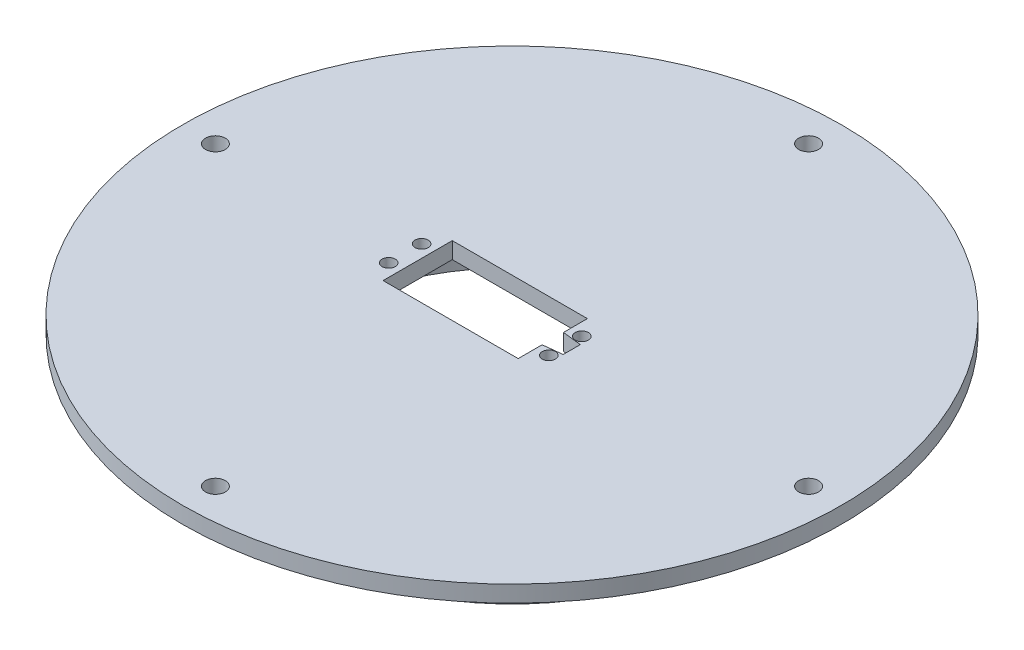
ISO-10303-21;
HEADER;
FILE_DESCRIPTION(('STEP AP214'),'2;1');
FILE_NAME('part.step','',(''),(''),'','','');
FILE_SCHEMA(('AUTOMOTIVE_DESIGN { 1 0 10303 214 1 1 1 1 }'));
ENDSEC;
DATA;
#1=APPLICATION_CONTEXT('core data for automotive mechanical design processes');
#2=APPLICATION_PROTOCOL_DEFINITION('international standard','automotive_design',2000,#1);
#3=PRODUCT_CONTEXT('',#1,'mechanical');
#4=PRODUCT('Part','Part','',(#3));
#5=PRODUCT_RELATED_PRODUCT_CATEGORY('part','',(#4));
#6=PRODUCT_DEFINITION_FORMATION('','',#4);
#7=PRODUCT_DEFINITION_CONTEXT('part definition',#1,'design');
#8=PRODUCT_DEFINITION('design','',#6,#7);
#9=PRODUCT_DEFINITION_SHAPE('','',#8);
#10=(LENGTH_UNIT() NAMED_UNIT(*) SI_UNIT(.MILLI.,.METRE.));
#11=(NAMED_UNIT(*) PLANE_ANGLE_UNIT() SI_UNIT($,.RADIAN.));
#12=(NAMED_UNIT(*) SI_UNIT($,.STERADIAN.) SOLID_ANGLE_UNIT());
#13=UNCERTAINTY_MEASURE_WITH_UNIT(LENGTH_MEASURE(1.E-05),#10,'distance_accuracy_value','');
#14=(GEOMETRIC_REPRESENTATION_CONTEXT(3) GLOBAL_UNCERTAINTY_ASSIGNED_CONTEXT((#13)) GLOBAL_UNIT_ASSIGNED_CONTEXT((#10,
#11,#12)) REPRESENTATION_CONTEXT('',''));
#15=CARTESIAN_POINT('',(0.,0.,0.));
#16=DIRECTION('',(0.,0.,1.));
#17=DIRECTION('',(1.,0.,0.));
#18=AXIS2_PLACEMENT_3D('',#15,#16,#17);
#19=CARTESIAN_POINT('',(0.,-25.,0.));
#20=DIRECTION('',(0.,-1.,0.));
#21=DIRECTION('',(0.,0.,-1.));
#22=AXIS2_PLACEMENT_3D('',#19,#20,#21);
#23=PLANE('',#22);
#24=CARTESIAN_POINT('',(0.,-25.,0.));
#25=DIRECTION('',(0.,-1.,0.));
#26=DIRECTION('',(0.,0.,-1.));
#27=AXIS2_PLACEMENT_3D('',#24,#25,#26);
#28=CIRCLE('',#27,65.);
#29=CARTESIAN_POINT('',(64.8074069840786,-25.,5.));
#30=VERTEX_POINT('',#29);
#31=CARTESIAN_POINT('',(64.8074069840786,-25.,-5.));
#32=VERTEX_POINT('',#31);
#33=EDGE_CURVE('E146',#30,#32,#28,.T.);
#34=ORIENTED_EDGE('',*,*,#33,.T.);
#35=DIRECTION('',(-1.,0.,0.));
#36=VECTOR('',#35,1.);
#37=CARTESIAN_POINT('',(100.,-25.,-5.));
#38=LINE('',#37,#36);
#39=CARTESIAN_POINT('',(59.791303715507,-25.,-5.));
#40=VERTEX_POINT('',#39);
#41=EDGE_CURVE('E129',#32,#40,#38,.T.);
#42=ORIENTED_EDGE('',*,*,#41,.T.);
#43=CARTESIAN_POINT('',(0.,-25.,0.));
#44=DIRECTION('',(0.,-1.,0.));
#45=DIRECTION('',(0.,0.,-1.));
#46=AXIS2_PLACEMENT_3D('',#43,#44,#45);
#47=CIRCLE('',#46,60.);
#48=CARTESIAN_POINT('',(59.791303715507,-25.,5.));
#49=VERTEX_POINT('',#48);
#50=EDGE_CURVE('E149',#49,#40,#47,.T.);
#51=ORIENTED_EDGE('',*,*,#50,.F.);
#52=DIRECTION('',(-1.,0.,0.));
#53=VECTOR('',#52,1.);
#54=CARTESIAN_POINT('',(100.,-25.,5.));
#55=LINE('',#54,#53);
#56=EDGE_CURVE('E57',#30,#49,#55,.T.);
#57=ORIENTED_EDGE('',*,*,#56,.F.);
#58=EDGE_LOOP('',(#34,#42,#51,#57));
#59=FACE_BOUND('',#58,.T.);
#60=ADVANCED_FACE('F41',(#59),#23,.T.);
#61=CARTESIAN_POINT('',(0.,-25.,0.));
#62=DIRECTION('',(0.,1.,0.));
#63=DIRECTION('',(0.,0.,1.));
#64=AXIS2_PLACEMENT_3D('',#61,#62,#63);
#65=CYLINDRICAL_SURFACE('',#64,65.);
#66=CARTESIAN_POINT('',(0.,0.,0.));
#67=DIRECTION('',(0.,-1.,0.));
#68=DIRECTION('',(0.,0.,-1.));
#69=AXIS2_PLACEMENT_3D('',#66,#67,#68);
#70=CIRCLE('',#69,65.);
#71=CARTESIAN_POINT('',(0.,0.,-65.));
#72=VERTEX_POINT('',#71);
#73=EDGE_CURVE('E159',#72,#72,#70,.T.);
#74=ORIENTED_EDGE('',*,*,#73,.T.);
#75=EDGE_LOOP('',(#74));
#76=FACE_BOUND('',#75,.T.);
#77=DIRECTION('',(0.,1.,0.));
#78=VECTOR('',#77,1.);
#79=CARTESIAN_POINT('',(64.8074069840786,-25.,-5.));
#80=LINE('',#79,#78);
#81=CARTESIAN_POINT('',(64.8074069840786,-19.,-5.));
#82=VERTEX_POINT('',#81);
#83=EDGE_CURVE('E135',#32,#82,#80,.T.);
#84=ORIENTED_EDGE('',*,*,#83,.F.);
#85=ORIENTED_EDGE('',*,*,#33,.F.);
#86=DIRECTION('',(0.,1.,0.));
#87=VECTOR('',#86,1.);
#88=CARTESIAN_POINT('',(64.8074069840786,-25.,5.));
#89=LINE('',#88,#87);
#90=CARTESIAN_POINT('',(64.8074069840786,-19.,5.));
#91=VERTEX_POINT('',#90);
#92=EDGE_CURVE('E262',#91,#30,#89,.F.);
#93=ORIENTED_EDGE('',*,*,#92,.F.);
#94=CARTESIAN_POINT('',(0.,-19.,0.));
#95=DIRECTION('',(0.,-1.,0.));
#96=DIRECTION('',(0.,0.,-1.));
#97=AXIS2_PLACEMENT_3D('',#94,#95,#96);
#98=CIRCLE('',#97,65.);
#99=EDGE_CURVE('E150',#82,#91,#98,.T.);
#100=ORIENTED_EDGE('',*,*,#99,.F.);
#101=EDGE_LOOP('',(#84,#85,#93,#100));
#102=FACE_BOUND('',#101,.T.);
#103=ADVANCED_FACE('F144',(#76,#102),#65,.T.);
#104=CARTESIAN_POINT('',(0.,-25.,0.));
#105=DIRECTION('',(0.,1.,0.));
#106=DIRECTION('',(0.,0.,1.));
#107=AXIS2_PLACEMENT_3D('',#104,#105,#106);
#108=CYLINDRICAL_SURFACE('',#107,60.);
#109=CARTESIAN_POINT('',(0.,0.,0.));
#110=DIRECTION('',(0.,-1.,0.));
#111=DIRECTION('',(0.,0.,-1.));
#112=AXIS2_PLACEMENT_3D('',#109,#110,#111);
#113=CIRCLE('',#112,60.);
#114=CARTESIAN_POINT('',(0.,0.,-60.));
#115=VERTEX_POINT('',#114);
#116=EDGE_CURVE('E151',#115,#115,#113,.T.);
#117=ORIENTED_EDGE('',*,*,#116,.F.);
#118=EDGE_LOOP('',(#117));
#119=FACE_BOUND('',#118,.T.);
#120=ORIENTED_EDGE('',*,*,#50,.T.);
#121=DIRECTION('',(0.,1.,0.));
#122=VECTOR('',#121,1.);
#123=CARTESIAN_POINT('',(59.791303715507,-25.,-5.));
#124=LINE('',#123,#122);
#125=CARTESIAN_POINT('',(59.791303715507,-19.,-5.));
#126=VERTEX_POINT('',#125);
#127=EDGE_CURVE('E11',#40,#126,#124,.T.);
#128=ORIENTED_EDGE('',*,*,#127,.T.);
#129=CARTESIAN_POINT('',(0.,-19.,0.));
#130=DIRECTION('',(0.,-1.,0.));
#131=DIRECTION('',(0.,0.,-1.));
#132=AXIS2_PLACEMENT_3D('',#129,#130,#131);
#133=CIRCLE('',#132,60.);
#134=CARTESIAN_POINT('',(59.791303715507,-19.,5.));
#135=VERTEX_POINT('',#134);
#136=EDGE_CURVE('E47',#126,#135,#133,.T.);
#137=ORIENTED_EDGE('',*,*,#136,.T.);
#138=DIRECTION('',(0.,1.,0.));
#139=VECTOR('',#138,1.);
#140=CARTESIAN_POINT('',(59.791303715507,-25.,5.));
#141=LINE('',#140,#139);
#142=EDGE_CURVE('E254',#135,#49,#141,.F.);
#143=ORIENTED_EDGE('',*,*,#142,.T.);
#144=EDGE_LOOP('',(#120,#128,#137,#143));
#145=FACE_BOUND('',#144,.T.);
#146=ADVANCED_FACE('F256',(#119,#145),#108,.F.);
#147=CARTESIAN_POINT('',(12.3770131335218,10.,-10.5));
#148=DIRECTION('',(-1.,0.,0.));
#149=DIRECTION('',(0.,0.,1.));
#150=AXIS2_PLACEMENT_3D('',#147,#148,#149);
#151=PLANE('',#150);
#152=DIRECTION('',(0.,0.,-1.));
#153=VECTOR('',#152,1.);
#154=CARTESIAN_POINT('',(12.3770131335218,0.,-10.5));
#155=LINE('',#154,#153);
#156=CARTESIAN_POINT('',(12.3770131335218,0.,-3.24999999999999));
#157=VERTEX_POINT('',#156);
#158=CARTESIAN_POINT('',(12.3770131335218,0.,-10.5));
#159=VERTEX_POINT('',#158);
#160=EDGE_CURVE('E185',#157,#159,#155,.T.);
#161=ORIENTED_EDGE('',*,*,#160,.F.);
#162=DIRECTION('',(0.,1.,0.));
#163=VECTOR('',#162,1.);
#164=CARTESIAN_POINT('',(12.3770131335218,-25.,-3.24999999999999));
#165=LINE('',#164,#163);
#166=CARTESIAN_POINT('',(12.3770131335218,5.,-3.24999999999999));
#167=VERTEX_POINT('',#166);
#168=EDGE_CURVE('E277',#157,#167,#165,.T.);
#169=ORIENTED_EDGE('',*,*,#168,.T.);
#170=DIRECTION('',(0.,0.,1.));
#171=VECTOR('',#170,1.);
#172=CARTESIAN_POINT('',(12.3770131335218,5.,0.));
#173=LINE('',#172,#171);
#174=CARTESIAN_POINT('',(12.3770131335218,5.,-10.5));
#175=VERTEX_POINT('',#174);
#176=EDGE_CURVE('E202',#175,#167,#173,.T.);
#177=ORIENTED_EDGE('',*,*,#176,.F.);
#178=DIRECTION('',(0.,-1.,0.));
#179=VECTOR('',#178,1.);
#180=CARTESIAN_POINT('',(12.3770131335218,10.,-10.5));
#181=LINE('',#180,#179);
#182=EDGE_CURVE('E173',#175,#159,#181,.T.);
#183=ORIENTED_EDGE('',*,*,#182,.T.);
#184=EDGE_LOOP('',(#161,#169,#177,#183));
#185=FACE_BOUND('',#184,.T.);
#186=ADVANCED_FACE('F300',(#185),#151,.T.);
#187=CARTESIAN_POINT('',(0.,0.,0.));
#188=DIRECTION('',(0.,1.,0.));
#189=DIRECTION('',(0.,0.,1.));
#190=AXIS2_PLACEMENT_3D('',#187,#188,#189);
#191=PLANE('',#190);
#192=ORIENTED_EDGE('',*,*,#116,.T.);
#193=EDGE_LOOP('',(#192));
#194=FACE_BOUND('',#193,.T.);
#195=CARTESIAN_POINT('',(-32.4229868664782,0.,-5.00000000000001));
#196=DIRECTION('',(0.,1.,0.));
#197=DIRECTION('',(0.,0.,-1.));
#198=AXIS2_PLACEMENT_3D('',#195,#196,#197);
#199=CIRCLE('',#198,2.00000000000001);
#200=CARTESIAN_POINT('',(-32.4229868664782,0.,-7.00000000000002));
#201=VERTEX_POINT('',#200);
#202=EDGE_CURVE('E148',#201,#201,#199,.T.);
#203=ORIENTED_EDGE('',*,*,#202,.T.);
#204=EDGE_LOOP('',(#203));
#205=FACE_BOUND('',#204,.T.);
#206=CARTESIAN_POINT('',(-32.4229868664782,0.,5.00000000000001));
#207=DIRECTION('',(0.,1.,0.));
#208=DIRECTION('',(0.,0.,1.));
#209=AXIS2_PLACEMENT_3D('',#206,#207,#208);
#210=CIRCLE('',#209,2.);
#211=CARTESIAN_POINT('',(-32.4229868664782,0.,7.));
#212=VERTEX_POINT('',#211);
#213=EDGE_CURVE('E152',#212,#212,#210,.T.);
#214=ORIENTED_EDGE('',*,*,#213,.T.);
#215=EDGE_LOOP('',(#214));
#216=FACE_BOUND('',#215,.T.);
#217=CARTESIAN_POINT('',(16.1770131335218,0.,5.));
#218=DIRECTION('',(0.,1.,0.));
#219=DIRECTION('',(0.,0.,-1.));
#220=AXIS2_PLACEMENT_3D('',#217,#218,#219);
#221=CIRCLE('',#220,2.);
#222=CARTESIAN_POINT('',(16.1770131335218,0.,3.));
#223=VERTEX_POINT('',#222);
#224=EDGE_CURVE('E165',#223,#223,#221,.T.);
#225=ORIENTED_EDGE('',*,*,#224,.T.);
#226=EDGE_LOOP('',(#225));
#227=FACE_BOUND('',#226,.T.);
#228=CARTESIAN_POINT('',(16.1770131335218,0.,-5.));
#229=DIRECTION('',(0.,1.,0.));
#230=DIRECTION('',(0.,0.,1.));
#231=AXIS2_PLACEMENT_3D('',#228,#229,#230);
#232=CIRCLE('',#231,2.);
#233=CARTESIAN_POINT('',(16.1770131335218,0.,-3.));
#234=VERTEX_POINT('',#233);
#235=EDGE_CURVE('E170',#234,#234,#232,.T.);
#236=ORIENTED_EDGE('',*,*,#235,.T.);
#237=EDGE_LOOP('',(#236));
#238=FACE_BOUND('',#237,.T.);
#239=DIRECTION('',(0.99367593409907,0.,0.112285965250968));
#240=VECTOR('',#239,1.);
#241=CARTESIAN_POINT('',(0.518672639093123,0.,-4.58999945354297));
#242=LINE('',#241,#240);
#243=CARTESIAN_POINT('',(18.1291955698643,0.,-2.6));
#244=VERTEX_POINT('',#243);
#245=EDGE_CURVE('E252',#157,#244,#242,.T.);
#246=ORIENTED_EDGE('',*,*,#245,.F.);
#247=ORIENTED_EDGE('',*,*,#160,.T.);
#248=DIRECTION('',(-1.,0.,0.));
#249=VECTOR('',#248,1.);
#250=CARTESIAN_POINT('',(-28.6229868664782,0.,-10.5));
#251=LINE('',#250,#249);
#252=CARTESIAN_POINT('',(-28.6229868664782,0.,-10.5));
#253=VERTEX_POINT('',#252);
#254=EDGE_CURVE('E177',#159,#253,#251,.T.);
#255=ORIENTED_EDGE('',*,*,#254,.T.);
#256=DIRECTION('',(0.,0.,1.));
#257=VECTOR('',#256,1.);
#258=CARTESIAN_POINT('',(-28.6229868664782,0.,-10.5));
#259=LINE('',#258,#257);
#260=CARTESIAN_POINT('',(-28.6229868664782,0.,10.5));
#261=VERTEX_POINT('',#260);
#262=EDGE_CURVE('E166',#253,#261,#259,.T.);
#263=ORIENTED_EDGE('',*,*,#262,.T.);
#264=DIRECTION('',(1.,0.,0.));
#265=VECTOR('',#264,1.);
#266=CARTESIAN_POINT('',(12.3770131335218,0.,10.5));
#267=LINE('',#266,#265);
#268=CARTESIAN_POINT('',(12.3770131335218,0.,10.5));
#269=VERTEX_POINT('',#268);
#270=EDGE_CURVE('E187',#261,#269,#267,.T.);
#271=ORIENTED_EDGE('',*,*,#270,.T.);
#272=CARTESIAN_POINT('',(12.3770131335218,0.,3.24999999999999));
#273=VERTEX_POINT('',#272);
#274=EDGE_CURVE('E182',#269,#273,#155,.T.);
#275=ORIENTED_EDGE('',*,*,#274,.T.);
#276=DIRECTION('',(0.99367593409907,0.,-0.11228596525097));
#277=VECTOR('',#276,1.);
#278=CARTESIAN_POINT('',(0.518672639093132,0.,4.58999945354299));
#279=LINE('',#278,#277);
#280=CARTESIAN_POINT('',(18.1291955698643,0.,2.59999999999999));
#281=VERTEX_POINT('',#280);
#282=EDGE_CURVE('E162',#273,#281,#279,.T.);
#283=ORIENTED_EDGE('',*,*,#282,.T.);
#284=DIRECTION('',(0.,0.,1.));
#285=VECTOR('',#284,1.);
#286=CARTESIAN_POINT('',(18.1291955698643,0.,0.));
#287=LINE('',#286,#285);
#288=EDGE_CURVE('E283',#244,#281,#287,.T.);
#289=ORIENTED_EDGE('',*,*,#288,.F.);
#290=EDGE_LOOP('',(#246,#247,#255,#263,#271,#275,#283,#289));
#291=FACE_BOUND('',#290,.T.);
#292=ADVANCED_FACE('F291',(#194,#205,#216,#227,#238,#291),#191,.F.);
#293=CARTESIAN_POINT('',(0.,5.,0.));
#294=DIRECTION('',(0.,-1.,0.));
#295=DIRECTION('',(0.,0.,-1.));
#296=AXIS2_PLACEMENT_3D('',#293,#294,#295);
#297=CYLINDRICAL_SURFACE('',#296,100.);
#298=CARTESIAN_POINT('',(0.,5.,0.));
#299=DIRECTION('',(0.,1.,0.));
#300=DIRECTION('',(0.,0.,1.));
#301=AXIS2_PLACEMENT_3D('',#298,#299,#300);
#302=CIRCLE('',#301,100.);
#303=CARTESIAN_POINT('',(0.,5.,100.));
#304=VERTEX_POINT('',#303);
#305=EDGE_CURVE('E161',#304,#304,#302,.T.);
#306=ORIENTED_EDGE('',*,*,#305,.F.);
#307=EDGE_LOOP('',(#306));
#308=FACE_BOUND('',#307,.T.);
#309=CARTESIAN_POINT('',(0.,0.,0.));
#310=DIRECTION('',(0.,1.,0.));
#311=DIRECTION('',(0.,0.,1.));
#312=AXIS2_PLACEMENT_3D('',#309,#310,#311);
#313=CIRCLE('',#312,100.);
#314=CARTESIAN_POINT('',(0.,0.,100.));
#315=VERTEX_POINT('',#314);
#316=EDGE_CURVE('E224',#315,#315,#313,.T.);
#317=ORIENTED_EDGE('',*,*,#316,.T.);
#318=EDGE_LOOP('',(#317));
#319=FACE_BOUND('',#318,.T.);
#320=ADVANCED_FACE('F43',(#308,#319),#297,.T.);
#321=CARTESIAN_POINT('',(0.,5.,0.));
#322=DIRECTION('',(0.,1.,0.));
#323=DIRECTION('',(0.,0.,1.));
#324=AXIS2_PLACEMENT_3D('',#321,#322,#323);
#325=PLANE('',#324);
#326=DIRECTION('',(0.99367593409907,0.,-0.11228596525097));
#327=VECTOR('',#326,1.);
#328=CARTESIAN_POINT('',(0.518672639093132,5.,4.58999945354299));
#329=LINE('',#328,#327);
#330=CARTESIAN_POINT('',(12.3770131335218,5.,3.24999999999999));
#331=VERTEX_POINT('',#330);
#332=CARTESIAN_POINT('',(18.1291955698643,5.,2.59999999999999));
#333=VERTEX_POINT('',#332);
#334=EDGE_CURVE('E63',#331,#333,#329,.T.);
#335=ORIENTED_EDGE('',*,*,#334,.F.);
#336=CARTESIAN_POINT('',(12.3770131335218,5.,10.5));
#337=VERTEX_POINT('',#336);
#338=EDGE_CURVE('E204',#331,#337,#173,.T.);
#339=ORIENTED_EDGE('',*,*,#338,.T.);
#340=DIRECTION('',(-1.,0.,0.));
#341=VECTOR('',#340,1.);
#342=CARTESIAN_POINT('',(0.,5.,10.5));
#343=LINE('',#342,#341);
#344=CARTESIAN_POINT('',(-28.6229868664782,5.,10.5));
#345=VERTEX_POINT('',#344);
#346=EDGE_CURVE('E206',#337,#345,#343,.T.);
#347=ORIENTED_EDGE('',*,*,#346,.T.);
#348=DIRECTION('',(0.,0.,-1.));
#349=VECTOR('',#348,1.);
#350=CARTESIAN_POINT('',(-28.6229868664782,5.,0.));
#351=LINE('',#350,#349);
#352=CARTESIAN_POINT('',(-28.6229868664782,5.,-10.5));
#353=VERTEX_POINT('',#352);
#354=EDGE_CURVE('E211',#345,#353,#351,.T.);
#355=ORIENTED_EDGE('',*,*,#354,.T.);
#356=DIRECTION('',(1.,0.,0.));
#357=VECTOR('',#356,1.);
#358=CARTESIAN_POINT('',(0.,5.,-10.5));
#359=LINE('',#358,#357);
#360=EDGE_CURVE('E203',#353,#175,#359,.T.);
#361=ORIENTED_EDGE('',*,*,#360,.T.);
#362=ORIENTED_EDGE('',*,*,#176,.T.);
#363=DIRECTION('',(0.99367593409907,0.,0.112285965250968));
#364=VECTOR('',#363,1.);
#365=CARTESIAN_POINT('',(0.518672639093123,5.,-4.58999945354297));
#366=LINE('',#365,#364);
#367=CARTESIAN_POINT('',(18.1291955698643,5.,-2.6));
#368=VERTEX_POINT('',#367);
#369=EDGE_CURVE('E274',#167,#368,#366,.T.);
#370=ORIENTED_EDGE('',*,*,#369,.T.);
#371=DIRECTION('',(0.,0.,1.));
#372=VECTOR('',#371,1.);
#373=CARTESIAN_POINT('',(18.1291955698643,5.,0.));
#374=LINE('',#373,#372);
#375=EDGE_CURVE('E272',#368,#333,#374,.T.);
#376=ORIENTED_EDGE('',*,*,#375,.T.);
#377=EDGE_LOOP('',(#335,#339,#347,#355,#361,#362,#370,#376));
#378=FACE_BOUND('',#377,.T.);
#379=CARTESIAN_POINT('',(-32.4229868664782,5.,-5.00000000000001));
#380=DIRECTION('',(0.,1.,0.));
#381=DIRECTION('',(0.,0.,1.));
#382=AXIS2_PLACEMENT_3D('',#379,#380,#381);
#383=CIRCLE('',#382,2.00000000000001);
#384=CARTESIAN_POINT('',(-32.4229868664782,5.,-3.));
#385=VERTEX_POINT('',#384);
#386=EDGE_CURVE('E219',#385,#385,#383,.F.);
#387=ORIENTED_EDGE('',*,*,#386,.T.);
#388=EDGE_LOOP('',(#387));
#389=FACE_BOUND('',#388,.T.);
#390=CARTESIAN_POINT('',(-32.4229868664782,5.,5.00000000000001));
#391=DIRECTION('',(0.,1.,0.));
#392=DIRECTION('',(0.,0.,1.));
#393=AXIS2_PLACEMENT_3D('',#390,#391,#392);
#394=CIRCLE('',#393,2.);
#395=CARTESIAN_POINT('',(-32.4229868664782,5.,7.));
#396=VERTEX_POINT('',#395);
#397=EDGE_CURVE('E213',#396,#396,#394,.F.);
#398=ORIENTED_EDGE('',*,*,#397,.T.);
#399=EDGE_LOOP('',(#398));
#400=FACE_BOUND('',#399,.T.);
#401=CARTESIAN_POINT('',(16.1770131335218,5.,5.));
#402=DIRECTION('',(0.,1.,0.));
#403=DIRECTION('',(0.,0.,1.));
#404=AXIS2_PLACEMENT_3D('',#401,#402,#403);
#405=CIRCLE('',#404,2.);
#406=CARTESIAN_POINT('',(16.1770131335218,5.,7.));
#407=VERTEX_POINT('',#406);
#408=EDGE_CURVE('E197',#407,#407,#405,.F.);
#409=ORIENTED_EDGE('',*,*,#408,.T.);
#410=EDGE_LOOP('',(#409));
#411=FACE_BOUND('',#410,.T.);
#412=CARTESIAN_POINT('',(16.1770131335218,5.,-5.));
#413=DIRECTION('',(0.,1.,0.));
#414=DIRECTION('',(0.,0.,1.));
#415=AXIS2_PLACEMENT_3D('',#412,#413,#414);
#416=CIRCLE('',#415,2.);
#417=CARTESIAN_POINT('',(16.1770131335218,5.,-3.));
#418=VERTEX_POINT('',#417);
#419=EDGE_CURVE('E194',#418,#418,#416,.F.);
#420=ORIENTED_EDGE('',*,*,#419,.T.);
#421=EDGE_LOOP('',(#420));
#422=FACE_BOUND('',#421,.T.);
#423=CARTESIAN_POINT('',(0.,5.,90.));
#424=DIRECTION('',(0.,-1.,0.));
#425=DIRECTION('',(0.,0.,-1.));
#426=AXIS2_PLACEMENT_3D('',#423,#424,#425);
#427=CIRCLE('',#426,3.);
#428=CARTESIAN_POINT('',(0.,5.,87.));
#429=VERTEX_POINT('',#428);
#430=EDGE_CURVE('E223',#429,#429,#427,.T.);
#431=ORIENTED_EDGE('',*,*,#430,.T.);
#432=EDGE_LOOP('',(#431));
#433=FACE_BOUND('',#432,.T.);
#434=CARTESIAN_POINT('',(90.,5.,0.));
#435=DIRECTION('',(0.,-1.,0.));
#436=DIRECTION('',(0.,0.,-1.));
#437=AXIS2_PLACEMENT_3D('',#434,#435,#436);
#438=CIRCLE('',#437,3.00000000000001);
#439=CARTESIAN_POINT('',(90.,5.,-3.));
#440=VERTEX_POINT('',#439);
#441=EDGE_CURVE('E233',#440,#440,#438,.T.);
#442=ORIENTED_EDGE('',*,*,#441,.T.);
#443=EDGE_LOOP('',(#442));
#444=FACE_BOUND('',#443,.T.);
#445=CARTESIAN_POINT('',(0.,5.,-90.));
#446=DIRECTION('',(0.,-1.,0.));
#447=DIRECTION('',(0.,0.,-1.));
#448=AXIS2_PLACEMENT_3D('',#445,#446,#447);
#449=CIRCLE('',#448,3.);
#450=CARTESIAN_POINT('',(0.,5.,-93.));
#451=VERTEX_POINT('',#450);
#452=EDGE_CURVE('E240',#451,#451,#449,.T.);
#453=ORIENTED_EDGE('',*,*,#452,.T.);
#454=EDGE_LOOP('',(#453));
#455=FACE_BOUND('',#454,.T.);
#456=CARTESIAN_POINT('',(-90.,5.,0.));
#457=DIRECTION('',(0.,-1.,0.));
#458=DIRECTION('',(0.,0.,-1.));
#459=AXIS2_PLACEMENT_3D('',#456,#457,#458);
#460=CIRCLE('',#459,3.00000000000001);
#461=CARTESIAN_POINT('',(-90.,5.,-3.));
#462=VERTEX_POINT('',#461);
#463=EDGE_CURVE('E216',#462,#462,#460,.T.);
#464=ORIENTED_EDGE('',*,*,#463,.T.);
#465=EDGE_LOOP('',(#464));
#466=FACE_BOUND('',#465,.T.);
#467=ORIENTED_EDGE('',*,*,#305,.T.);
#468=EDGE_LOOP('',(#467));
#469=FACE_BOUND('',#468,.T.);
#470=ADVANCED_FACE('F364',(#378,#389,#400,#411,#422,#433,#444,#455,#466,#469),#325,.T.);
#471=ORIENTED_EDGE('',*,*,#73,.F.);
#472=EDGE_LOOP('',(#471));
#473=FACE_BOUND('',#472,.T.);
#474=CARTESIAN_POINT('',(0.,0.,90.));
#475=DIRECTION('',(0.,-1.,0.));
#476=DIRECTION('',(0.,0.,-1.));
#477=AXIS2_PLACEMENT_3D('',#474,#475,#476);
#478=CIRCLE('',#477,3.);
#479=CARTESIAN_POINT('',(0.,0.,87.));
#480=VERTEX_POINT('',#479);
#481=EDGE_CURVE('E222',#480,#480,#478,.T.);
#482=ORIENTED_EDGE('',*,*,#481,.F.);
#483=EDGE_LOOP('',(#482));
#484=FACE_BOUND('',#483,.T.);
#485=CARTESIAN_POINT('',(90.,0.,0.));
#486=DIRECTION('',(0.,-1.,0.));
#487=DIRECTION('',(0.,0.,-1.));
#488=AXIS2_PLACEMENT_3D('',#485,#486,#487);
#489=CIRCLE('',#488,3.00000000000001);
#490=CARTESIAN_POINT('',(90.,0.,-3.));
#491=VERTEX_POINT('',#490);
#492=EDGE_CURVE('E226',#491,#491,#489,.T.);
#493=ORIENTED_EDGE('',*,*,#492,.F.);
#494=EDGE_LOOP('',(#493));
#495=FACE_BOUND('',#494,.T.);
#496=CARTESIAN_POINT('',(0.,0.,-90.));
#497=DIRECTION('',(0.,-1.,0.));
#498=DIRECTION('',(0.,0.,-1.));
#499=AXIS2_PLACEMENT_3D('',#496,#497,#498);
#500=CIRCLE('',#499,3.);
#501=CARTESIAN_POINT('',(0.,0.,-93.));
#502=VERTEX_POINT('',#501);
#503=EDGE_CURVE('E234',#502,#502,#500,.T.);
#504=ORIENTED_EDGE('',*,*,#503,.F.);
#505=EDGE_LOOP('',(#504));
#506=FACE_BOUND('',#505,.T.);
#507=CARTESIAN_POINT('',(-90.,0.,0.));
#508=DIRECTION('',(0.,-1.,0.));
#509=DIRECTION('',(0.,0.,-1.));
#510=AXIS2_PLACEMENT_3D('',#507,#508,#509);
#511=CIRCLE('',#510,3.00000000000001);
#512=CARTESIAN_POINT('',(-90.,0.,-3.));
#513=VERTEX_POINT('',#512);
#514=EDGE_CURVE('E239',#513,#513,#511,.T.);
#515=ORIENTED_EDGE('',*,*,#514,.F.);
#516=EDGE_LOOP('',(#515));
#517=FACE_BOUND('',#516,.T.);
#518=ORIENTED_EDGE('',*,*,#316,.F.);
#519=EDGE_LOOP('',(#518));
#520=FACE_BOUND('',#519,.T.);
#521=ADVANCED_FACE('F365',(#473,#484,#495,#506,#517,#520),#191,.F.);
#522=CARTESIAN_POINT('',(-90.,5.,0.));
#523=DIRECTION('',(0.,-1.,0.));
#524=DIRECTION('',(0.,0.,-1.));
#525=AXIS2_PLACEMENT_3D('',#522,#523,#524);
#526=CYLINDRICAL_SURFACE('',#525,3.00000000000001);
#527=ORIENTED_EDGE('',*,*,#463,.F.);
#528=EDGE_LOOP('',(#527));
#529=FACE_BOUND('',#528,.T.);
#530=ORIENTED_EDGE('',*,*,#514,.T.);
#531=EDGE_LOOP('',(#530));
#532=FACE_BOUND('',#531,.T.);
#533=ADVANCED_FACE('F356',(#529,#532),#526,.F.);
#534=CARTESIAN_POINT('',(0.,5.,-90.));
#535=DIRECTION('',(0.,-1.,0.));
#536=DIRECTION('',(0.,0.,-1.));
#537=AXIS2_PLACEMENT_3D('',#534,#535,#536);
#538=CYLINDRICAL_SURFACE('',#537,3.);
#539=ORIENTED_EDGE('',*,*,#452,.F.);
#540=EDGE_LOOP('',(#539));
#541=FACE_BOUND('',#540,.T.);
#542=ORIENTED_EDGE('',*,*,#503,.T.);
#543=EDGE_LOOP('',(#542));
#544=FACE_BOUND('',#543,.T.);
#545=ADVANCED_FACE('F354',(#541,#544),#538,.F.);
#546=CARTESIAN_POINT('',(90.,5.,0.));
#547=DIRECTION('',(0.,-1.,0.));
#548=DIRECTION('',(0.,0.,-1.));
#549=AXIS2_PLACEMENT_3D('',#546,#547,#548);
#550=CYLINDRICAL_SURFACE('',#549,3.00000000000001);
#551=ORIENTED_EDGE('',*,*,#441,.F.);
#552=EDGE_LOOP('',(#551));
#553=FACE_BOUND('',#552,.T.);
#554=ORIENTED_EDGE('',*,*,#492,.T.);
#555=EDGE_LOOP('',(#554));
#556=FACE_BOUND('',#555,.T.);
#557=ADVANCED_FACE('F346',(#553,#556),#550,.F.);
#558=CARTESIAN_POINT('',(0.,5.,90.));
#559=DIRECTION('',(0.,-1.,0.));
#560=DIRECTION('',(0.,0.,-1.));
#561=AXIS2_PLACEMENT_3D('',#558,#559,#560);
#562=CYLINDRICAL_SURFACE('',#561,3.);
#563=ORIENTED_EDGE('',*,*,#430,.F.);
#564=EDGE_LOOP('',(#563));
#565=FACE_BOUND('',#564,.T.);
#566=ORIENTED_EDGE('',*,*,#481,.T.);
#567=EDGE_LOOP('',(#566));
#568=FACE_BOUND('',#567,.T.);
#569=ADVANCED_FACE('F348',(#565,#568),#562,.F.);
#570=CARTESIAN_POINT('',(16.1770131335218,10.,-5.));
#571=DIRECTION('',(0.,-1.,0.));
#572=DIRECTION('',(0.,0.,-1.));
#573=AXIS2_PLACEMENT_3D('',#570,#571,#572);
#574=CYLINDRICAL_SURFACE('',#573,2.);
#575=ORIENTED_EDGE('',*,*,#419,.F.);
#576=EDGE_LOOP('',(#575));
#577=FACE_BOUND('',#576,.T.);
#578=ORIENTED_EDGE('',*,*,#235,.F.);
#579=EDGE_LOOP('',(#578));
#580=FACE_BOUND('',#579,.T.);
#581=ADVANCED_FACE('F318',(#577,#580),#574,.F.);
#582=CARTESIAN_POINT('',(16.1770131335218,10.,5.));
#583=DIRECTION('',(0.,-1.,0.));
#584=DIRECTION('',(0.,0.,-1.));
#585=AXIS2_PLACEMENT_3D('',#582,#583,#584);
#586=CYLINDRICAL_SURFACE('',#585,2.);
#587=ORIENTED_EDGE('',*,*,#408,.F.);
#588=EDGE_LOOP('',(#587));
#589=FACE_BOUND('',#588,.T.);
#590=ORIENTED_EDGE('',*,*,#224,.F.);
#591=EDGE_LOOP('',(#590));
#592=FACE_BOUND('',#591,.T.);
#593=ADVANCED_FACE('F317',(#589,#592),#586,.F.);
#594=CARTESIAN_POINT('',(-28.6229868664782,10.,-10.5));
#595=DIRECTION('',(1.,0.,0.));
#596=DIRECTION('',(0.,0.,-1.));
#597=AXIS2_PLACEMENT_3D('',#594,#595,#596);
#598=PLANE('',#597);
#599=DIRECTION('',(0.,-1.,0.));
#600=VECTOR('',#599,1.);
#601=CARTESIAN_POINT('',(-28.6229868664782,10.,10.5));
#602=LINE('',#601,#600);
#603=EDGE_CURVE('E169',#345,#261,#602,.T.);
#604=ORIENTED_EDGE('',*,*,#603,.T.);
#605=ORIENTED_EDGE('',*,*,#262,.F.);
#606=DIRECTION('',(0.,-1.,0.));
#607=VECTOR('',#606,1.);
#608=CARTESIAN_POINT('',(-28.6229868664782,10.,-10.5));
#609=LINE('',#608,#607);
#610=EDGE_CURVE('E176',#353,#253,#609,.T.);
#611=ORIENTED_EDGE('',*,*,#610,.F.);
#612=ORIENTED_EDGE('',*,*,#354,.F.);
#613=EDGE_LOOP('',(#604,#605,#611,#612));
#614=FACE_BOUND('',#613,.T.);
#615=ADVANCED_FACE('F316',(#614),#598,.T.);
#616=CARTESIAN_POINT('',(12.3770131335218,10.,10.5));
#617=DIRECTION('',(0.,0.,-1.));
#618=DIRECTION('',(-1.,0.,0.));
#619=AXIS2_PLACEMENT_3D('',#616,#617,#618);
#620=PLANE('',#619);
#621=DIRECTION('',(0.,-1.,0.));
#622=VECTOR('',#621,1.);
#623=CARTESIAN_POINT('',(12.3770131335218,10.,10.5));
#624=LINE('',#623,#622);
#625=EDGE_CURVE('E171',#337,#269,#624,.T.);
#626=ORIENTED_EDGE('',*,*,#625,.T.);
#627=ORIENTED_EDGE('',*,*,#270,.F.);
#628=ORIENTED_EDGE('',*,*,#603,.F.);
#629=ORIENTED_EDGE('',*,*,#346,.F.);
#630=EDGE_LOOP('',(#626,#627,#628,#629));
#631=FACE_BOUND('',#630,.T.);
#632=ADVANCED_FACE('F323',(#631),#620,.T.);
#633=DIRECTION('',(0.,1.,0.));
#634=VECTOR('',#633,1.);
#635=CARTESIAN_POINT('',(12.3770131335218,-25.,3.24999999999999));
#636=LINE('',#635,#634);
#637=EDGE_CURVE('E280',#273,#331,#636,.T.);
#638=ORIENTED_EDGE('',*,*,#637,.F.);
#639=ORIENTED_EDGE('',*,*,#274,.F.);
#640=ORIENTED_EDGE('',*,*,#625,.F.);
#641=ORIENTED_EDGE('',*,*,#338,.F.);
#642=EDGE_LOOP('',(#638,#639,#640,#641));
#643=FACE_BOUND('',#642,.T.);
#644=ADVANCED_FACE('F306',(#643),#151,.T.);
#645=CARTESIAN_POINT('',(-28.6229868664782,10.,-10.5));
#646=DIRECTION('',(0.,0.,1.));
#647=DIRECTION('',(1.,0.,0.));
#648=AXIS2_PLACEMENT_3D('',#645,#646,#647);
#649=PLANE('',#648);
#650=ORIENTED_EDGE('',*,*,#610,.T.);
#651=ORIENTED_EDGE('',*,*,#254,.F.);
#652=ORIENTED_EDGE('',*,*,#182,.F.);
#653=ORIENTED_EDGE('',*,*,#360,.F.);
#654=EDGE_LOOP('',(#650,#651,#652,#653));
#655=FACE_BOUND('',#654,.T.);
#656=ADVANCED_FACE('F326',(#655),#649,.T.);
#657=CARTESIAN_POINT('',(-32.4229868664782,10.,5.00000000000001));
#658=DIRECTION('',(0.,-1.,0.));
#659=DIRECTION('',(0.,0.,-1.));
#660=AXIS2_PLACEMENT_3D('',#657,#658,#659);
#661=CYLINDRICAL_SURFACE('',#660,2.);
#662=ORIENTED_EDGE('',*,*,#397,.F.);
#663=EDGE_LOOP('',(#662));
#664=FACE_BOUND('',#663,.T.);
#665=ORIENTED_EDGE('',*,*,#213,.F.);
#666=EDGE_LOOP('',(#665));
#667=FACE_BOUND('',#666,.T.);
#668=ADVANCED_FACE('F334',(#664,#667),#661,.F.);
#669=CARTESIAN_POINT('',(-32.4229868664782,10.,-5.00000000000001));
#670=DIRECTION('',(0.,-1.,0.));
#671=DIRECTION('',(0.,0.,-1.));
#672=AXIS2_PLACEMENT_3D('',#669,#670,#671);
#673=CYLINDRICAL_SURFACE('',#672,2.00000000000001);
#674=ORIENTED_EDGE('',*,*,#386,.F.);
#675=EDGE_LOOP('',(#674));
#676=FACE_BOUND('',#675,.T.);
#677=ORIENTED_EDGE('',*,*,#202,.F.);
#678=EDGE_LOOP('',(#677));
#679=FACE_BOUND('',#678,.T.);
#680=ADVANCED_FACE('F336',(#676,#679),#673,.F.);
#681=CARTESIAN_POINT('',(0.518672639093123,-25.,-4.58999945354297));
#682=DIRECTION('',(-0.112285965250968,0.,0.99367593409907));
#683=DIRECTION('',(0.99367593409907,0.,0.112285965250968));
#684=AXIS2_PLACEMENT_3D('',#681,#682,#683);
#685=PLANE('',#684);
#686=ORIENTED_EDGE('',*,*,#245,.T.);
#687=DIRECTION('',(0.,1.,0.));
#688=VECTOR('',#687,1.);
#689=CARTESIAN_POINT('',(18.1291955698643,-25.,-2.6));
#690=LINE('',#689,#688);
#691=EDGE_CURVE('E284',#244,#368,#690,.T.);
#692=ORIENTED_EDGE('',*,*,#691,.T.);
#693=ORIENTED_EDGE('',*,*,#369,.F.);
#694=ORIENTED_EDGE('',*,*,#168,.F.);
#695=EDGE_LOOP('',(#686,#692,#693,#694));
#696=FACE_BOUND('',#695,.T.);
#697=ADVANCED_FACE('F345',(#696),#685,.T.);
#698=CARTESIAN_POINT('',(0.518672639093132,-25.,4.58999945354299));
#699=DIRECTION('',(0.11228596525097,0.,0.993675934099069));
#700=DIRECTION('',(0.99367593409907,0.,-0.11228596525097));
#701=AXIS2_PLACEMENT_3D('',#698,#699,#700);
#702=PLANE('',#701);
#703=ORIENTED_EDGE('',*,*,#637,.T.);
#704=ORIENTED_EDGE('',*,*,#334,.T.);
#705=DIRECTION('',(0.,1.,0.));
#706=VECTOR('',#705,1.);
#707=CARTESIAN_POINT('',(18.1291955698643,-25.,2.59999999999999));
#708=LINE('',#707,#706);
#709=EDGE_CURVE('E285',#281,#333,#708,.T.);
#710=ORIENTED_EDGE('',*,*,#709,.F.);
#711=ORIENTED_EDGE('',*,*,#282,.F.);
#712=EDGE_LOOP('',(#703,#704,#710,#711));
#713=FACE_BOUND('',#712,.T.);
#714=ADVANCED_FACE('F465',(#713),#702,.F.);
#715=CARTESIAN_POINT('',(18.1291955698643,-25.,0.));
#716=DIRECTION('',(-1.,0.,0.));
#717=DIRECTION('',(0.,0.,1.));
#718=AXIS2_PLACEMENT_3D('',#715,#716,#717);
#719=PLANE('',#718);
#720=ORIENTED_EDGE('',*,*,#288,.T.);
#721=ORIENTED_EDGE('',*,*,#709,.T.);
#722=ORIENTED_EDGE('',*,*,#375,.F.);
#723=ORIENTED_EDGE('',*,*,#691,.F.);
#724=EDGE_LOOP('',(#720,#721,#722,#723));
#725=FACE_BOUND('',#724,.T.);
#726=ADVANCED_FACE('F475',(#725),#719,.T.);
#727=CARTESIAN_POINT('',(100.,-25.,-5.));
#728=DIRECTION('',(0.,0.,1.));
#729=DIRECTION('',(1.,0.,0.));
#730=AXIS2_PLACEMENT_3D('',#727,#728,#729);
#731=PLANE('',#730);
#732=ORIENTED_EDGE('',*,*,#83,.T.);
#733=DIRECTION('',(-1.,0.,0.));
#734=VECTOR('',#733,1.);
#735=CARTESIAN_POINT('',(100.,-19.,-5.));
#736=LINE('',#735,#734);
#737=EDGE_CURVE('E259',#82,#126,#736,.T.);
#738=ORIENTED_EDGE('',*,*,#737,.T.);
#739=ORIENTED_EDGE('',*,*,#127,.F.);
#740=ORIENTED_EDGE('',*,*,#41,.F.);
#741=EDGE_LOOP('',(#732,#738,#739,#740));
#742=FACE_BOUND('',#741,.T.);
#743=ADVANCED_FACE('F134',(#742),#731,.T.);
#744=CARTESIAN_POINT('',(100.,-19.,5.));
#745=DIRECTION('',(0.,-1.,0.));
#746=DIRECTION('',(0.,0.,-1.));
#747=AXIS2_PLACEMENT_3D('',#744,#745,#746);
#748=PLANE('',#747);
#749=ORIENTED_EDGE('',*,*,#99,.T.);
#750=DIRECTION('',(-1.,0.,0.));
#751=VECTOR('',#750,1.);
#752=CARTESIAN_POINT('',(100.,-19.,5.));
#753=LINE('',#752,#751);
#754=EDGE_CURVE('E264',#91,#135,#753,.T.);
#755=ORIENTED_EDGE('',*,*,#754,.T.);
#756=ORIENTED_EDGE('',*,*,#136,.F.);
#757=ORIENTED_EDGE('',*,*,#737,.F.);
#758=EDGE_LOOP('',(#749,#755,#756,#757));
#759=FACE_BOUND('',#758,.T.);
#760=ADVANCED_FACE('F258',(#759),#748,.T.);
#761=CARTESIAN_POINT('',(100.,-25.,5.));
#762=DIRECTION('',(0.,0.,-1.));
#763=DIRECTION('',(0.,1.,0.));
#764=AXIS2_PLACEMENT_3D('',#761,#762,#763);
#765=PLANE('',#764);
#766=ORIENTED_EDGE('',*,*,#92,.T.);
#767=ORIENTED_EDGE('',*,*,#56,.T.);
#768=ORIENTED_EDGE('',*,*,#142,.F.);
#769=ORIENTED_EDGE('',*,*,#754,.F.);
#770=EDGE_LOOP('',(#766,#767,#768,#769));
#771=FACE_BOUND('',#770,.T.);
#772=ADVANCED_FACE('F510',(#771),#765,.T.);
#773=CLOSED_SHELL('',(#60,#103,#146,#186,#292,#320,#470,#521,#533,#545,#557,#569,#581,#593,#615,
#632,#644,#656,#668,#680,#697,#714,#726,#743,#760,#772));
#774=MANIFOLD_SOLID_BREP('B2',#773);
#775=ADVANCED_BREP_SHAPE_REPRESENTATION('',(#18,#774),#14);
#776=SHAPE_DEFINITION_REPRESENTATION(#9,#775);
ENDSEC;
END-ISO-10303-21;
